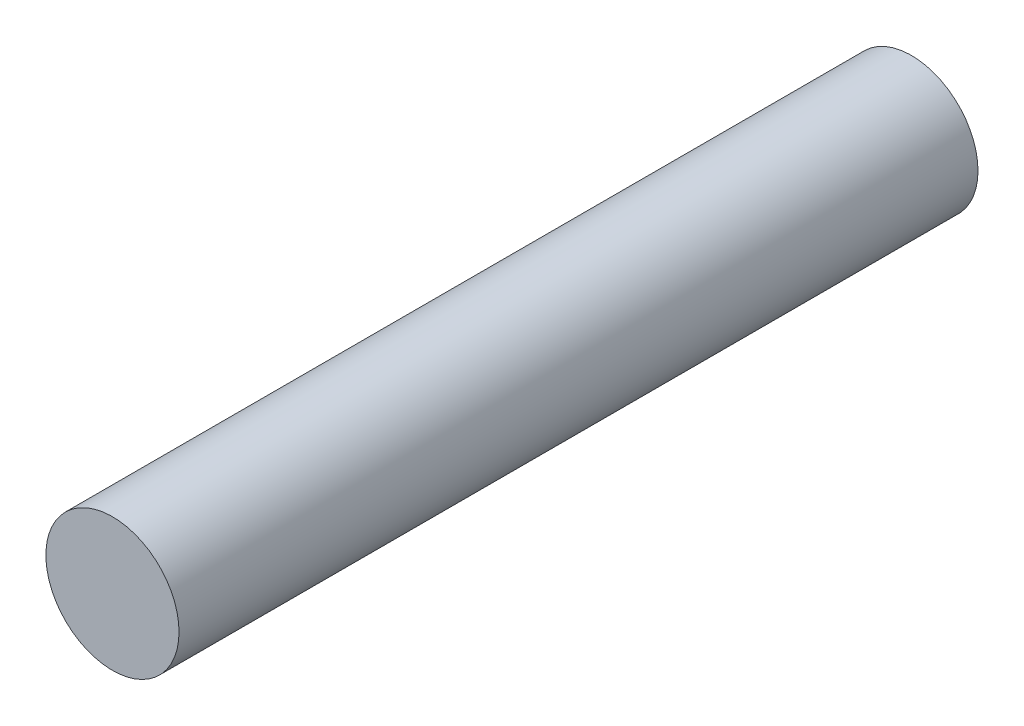
ISO-10303-21;
HEADER;
FILE_DESCRIPTION(('STEP AP214'),'2;1');
FILE_NAME('part.step','',(''),(''),'','','');
FILE_SCHEMA(('AUTOMOTIVE_DESIGN { 1 0 10303 214 1 1 1 1 }'));
ENDSEC;
DATA;
#1=APPLICATION_CONTEXT('core data for automotive mechanical design processes');
#2=APPLICATION_PROTOCOL_DEFINITION('international standard','automotive_design',2000,#1);
#3=PRODUCT_CONTEXT('',#1,'mechanical');
#4=PRODUCT('Part','Part','',(#3));
#5=PRODUCT_RELATED_PRODUCT_CATEGORY('part','',(#4));
#6=PRODUCT_DEFINITION_FORMATION('','',#4);
#7=PRODUCT_DEFINITION_CONTEXT('part definition',#1,'design');
#8=PRODUCT_DEFINITION('design','',#6,#7);
#9=PRODUCT_DEFINITION_SHAPE('','',#8);
#10=(LENGTH_UNIT() NAMED_UNIT(*) SI_UNIT(.MILLI.,.METRE.));
#11=(NAMED_UNIT(*) PLANE_ANGLE_UNIT() SI_UNIT($,.RADIAN.));
#12=(NAMED_UNIT(*) SI_UNIT($,.STERADIAN.) SOLID_ANGLE_UNIT());
#13=UNCERTAINTY_MEASURE_WITH_UNIT(LENGTH_MEASURE(1.E-05),#10,'distance_accuracy_value','');
#14=(GEOMETRIC_REPRESENTATION_CONTEXT(3) GLOBAL_UNCERTAINTY_ASSIGNED_CONTEXT((#13)) GLOBAL_UNIT_ASSIGNED_CONTEXT((#10,
#11,#12)) REPRESENTATION_CONTEXT('',''));
#15=CARTESIAN_POINT('',(0.,0.,0.));
#16=DIRECTION('',(0.,0.,1.));
#17=DIRECTION('',(1.,0.,0.));
#18=AXIS2_PLACEMENT_3D('',#15,#16,#17);
#19=CARTESIAN_POINT('',(0.,0.,300.));
#20=DIRECTION('',(0.,0.,-1.));
#21=DIRECTION('',(-1.,0.,0.));
#22=AXIS2_PLACEMENT_3D('',#19,#20,#21);
#23=CYLINDRICAL_SURFACE('',#22,25.);
#24=CARTESIAN_POINT('',(0.,0.,300.));
#25=DIRECTION('',(0.,0.,1.));
#26=DIRECTION('',(1.,0.,0.));
#27=AXIS2_PLACEMENT_3D('',#24,#25,#26);
#28=CIRCLE('',#27,25.);
#29=CARTESIAN_POINT('',(25.,0.,300.));
#30=VERTEX_POINT('',#29);
#31=EDGE_CURVE('E10',#30,#30,#28,.T.);
#32=ORIENTED_EDGE('',*,*,#31,.F.);
#33=EDGE_LOOP('',(#32));
#34=FACE_BOUND('',#33,.T.);
#35=CARTESIAN_POINT('',(0.,0.,0.));
#36=DIRECTION('',(0.,0.,1.));
#37=DIRECTION('',(1.,0.,0.));
#38=AXIS2_PLACEMENT_3D('',#35,#36,#37);
#39=CIRCLE('',#38,25.);
#40=CARTESIAN_POINT('',(25.,0.,0.));
#41=VERTEX_POINT('',#40);
#42=EDGE_CURVE('E33',#41,#41,#39,.T.);
#43=ORIENTED_EDGE('',*,*,#42,.T.);
#44=EDGE_LOOP('',(#43));
#45=FACE_BOUND('',#44,.T.);
#46=ADVANCED_FACE('F30',(#34,#45),#23,.T.);
#47=CARTESIAN_POINT('',(0.,0.,300.));
#48=DIRECTION('',(0.,0.,1.));
#49=DIRECTION('',(1.,0.,0.));
#50=AXIS2_PLACEMENT_3D('',#47,#48,#49);
#51=PLANE('',#50);
#52=ORIENTED_EDGE('',*,*,#31,.T.);
#53=EDGE_LOOP('',(#52));
#54=FACE_BOUND('',#53,.T.);
#55=ADVANCED_FACE('F45',(#54),#51,.T.);
#56=CARTESIAN_POINT('',(0.,0.,0.));
#57=DIRECTION('',(0.,0.,1.));
#58=DIRECTION('',(1.,0.,0.));
#59=AXIS2_PLACEMENT_3D('',#56,#57,#58);
#60=PLANE('',#59);
#61=ORIENTED_EDGE('',*,*,#42,.F.);
#62=EDGE_LOOP('',(#61));
#63=FACE_BOUND('',#62,.T.);
#64=ADVANCED_FACE('F43',(#63),#60,.F.);
#65=CLOSED_SHELL('',(#46,#55,#64));
#66=MANIFOLD_SOLID_BREP('B2',#65);
#67=ADVANCED_BREP_SHAPE_REPRESENTATION('',(#18,#66),#14);
#68=SHAPE_DEFINITION_REPRESENTATION(#9,#67);
ENDSEC;
END-ISO-10303-21;
